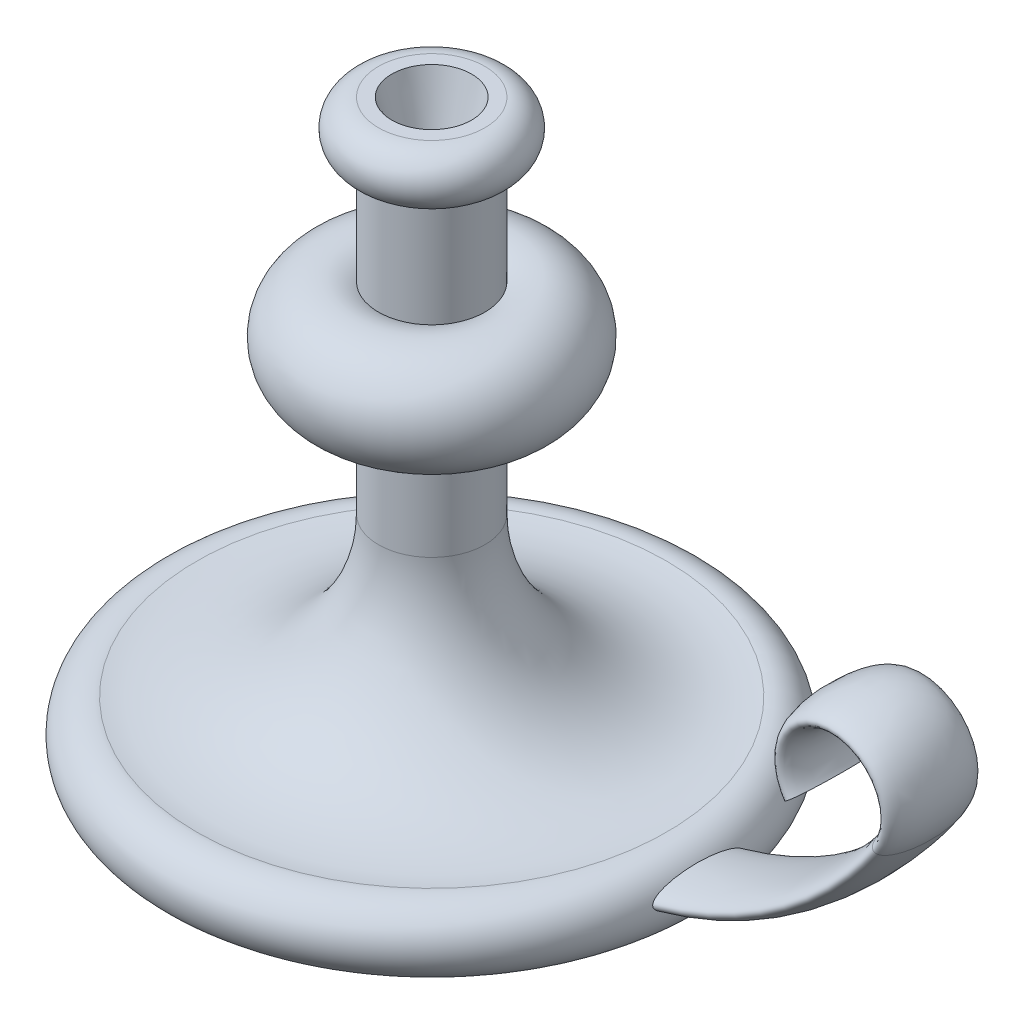
ISO-10303-21;
HEADER;
FILE_DESCRIPTION(('STEP AP214'),'2;1');
FILE_NAME('part.step','',(''),(''),'','','');
FILE_SCHEMA(('AUTOMOTIVE_DESIGN { 1 0 10303 214 1 1 1 1 }'));
ENDSEC;
DATA;
#1=APPLICATION_CONTEXT('core data for automotive mechanical design processes');
#2=APPLICATION_PROTOCOL_DEFINITION('international standard','automotive_design',2000,#1);
#3=PRODUCT_CONTEXT('',#1,'mechanical');
#4=PRODUCT('Part','Part','',(#3));
#5=PRODUCT_RELATED_PRODUCT_CATEGORY('part','',(#4));
#6=PRODUCT_DEFINITION_FORMATION('','',#4);
#7=PRODUCT_DEFINITION_CONTEXT('part definition',#1,'design');
#8=PRODUCT_DEFINITION('design','',#6,#7);
#9=PRODUCT_DEFINITION_SHAPE('','',#8);
#10=(LENGTH_UNIT() NAMED_UNIT(*) SI_UNIT(.MILLI.,.METRE.));
#11=(NAMED_UNIT(*) PLANE_ANGLE_UNIT() SI_UNIT($,.RADIAN.));
#12=(NAMED_UNIT(*) SI_UNIT($,.STERADIAN.) SOLID_ANGLE_UNIT());
#13=UNCERTAINTY_MEASURE_WITH_UNIT(LENGTH_MEASURE(1.E-05),#10,'distance_accuracy_value','');
#14=(GEOMETRIC_REPRESENTATION_CONTEXT(3) GLOBAL_UNCERTAINTY_ASSIGNED_CONTEXT((#13)) GLOBAL_UNIT_ASSIGNED_CONTEXT((#10,
#11,#12)) REPRESENTATION_CONTEXT('',''));
#15=CARTESIAN_POINT('',(0.,0.,0.));
#16=DIRECTION('',(0.,0.,1.));
#17=DIRECTION('',(1.,0.,0.));
#18=AXIS2_PLACEMENT_3D('',#15,#16,#17);
#19=CARTESIAN_POINT('',(0.,220.,0.));
#20=DIRECTION('',(0.,1.,0.));
#21=DIRECTION('',(0.,0.,1.));
#22=AXIS2_PLACEMENT_3D('',#19,#20,#21);
#23=PLANE('',#22);
#24=CARTESIAN_POINT('',(0.,220.,0.));
#25=DIRECTION('',(0.,1.,0.));
#26=DIRECTION('',(0.,0.,1.));
#27=AXIS2_PLACEMENT_3D('',#24,#25,#26);
#28=CIRCLE('',#27,15.);
#29=CARTESIAN_POINT('',(0.,220.,15.));
#30=VERTEX_POINT('',#29);
#31=EDGE_CURVE('E133',#30,#30,#28,.T.);
#32=ORIENTED_EDGE('',*,*,#31,.F.);
#33=EDGE_LOOP('',(#32));
#34=FACE_BOUND('',#33,.T.);
#35=CARTESIAN_POINT('',(0.,220.,0.));
#36=DIRECTION('',(0.,-1.,0.));
#37=DIRECTION('',(0.,0.,-1.));
#38=AXIS2_PLACEMENT_3D('',#35,#36,#37);
#39=CIRCLE('',#38,20.);
#40=CARTESIAN_POINT('',(0.,220.,-20.));
#41=VERTEX_POINT('',#40);
#42=EDGE_CURVE('E41',#41,#41,#39,.T.);
#43=ORIENTED_EDGE('',*,*,#42,.F.);
#44=EDGE_LOOP('',(#43));
#45=FACE_BOUND('',#44,.T.);
#46=ADVANCED_FACE('F31',(#34,#45),#23,.T.);
#47=CARTESIAN_POINT('',(0.,210.,0.));
#48=DIRECTION('',(0.,-1.,0.));
#49=DIRECTION('',(0.,0.,-1.));
#50=AXIS2_PLACEMENT_3D('',#47,#48,#49);
#51=TOROIDAL_SURFACE('',#50,20.,10.);
#52=ORIENTED_EDGE('',*,*,#42,.T.);
#53=EDGE_LOOP('',(#52));
#54=FACE_BOUND('',#53,.T.);
#55=CARTESIAN_POINT('',(0.,200.,0.));
#56=DIRECTION('',(0.,-1.,0.));
#57=DIRECTION('',(0.,0.,-1.));
#58=AXIS2_PLACEMENT_3D('',#55,#56,#57);
#59=CIRCLE('',#58,20.);
#60=CARTESIAN_POINT('',(0.,200.,-20.));
#61=VERTEX_POINT('',#60);
#62=EDGE_CURVE('E45',#61,#61,#59,.T.);
#63=ORIENTED_EDGE('',*,*,#62,.F.);
#64=EDGE_LOOP('',(#63));
#65=FACE_BOUND('',#64,.T.);
#66=ADVANCED_FACE('F106',(#54,#65),#51,.T.);
#67=CARTESIAN_POINT('',(0.,0.,0.));
#68=DIRECTION('',(0.,-1.,0.));
#69=DIRECTION('',(0.,0.,-1.));
#70=AXIS2_PLACEMENT_3D('',#67,#68,#69);
#71=CYLINDRICAL_SURFACE('',#70,20.);
#72=ORIENTED_EDGE('',*,*,#62,.T.);
#73=EDGE_LOOP('',(#72));
#74=FACE_BOUND('',#73,.T.);
#75=CARTESIAN_POINT('',(0.,160.,0.));
#76=DIRECTION('',(0.,-1.,0.));
#77=DIRECTION('',(0.,0.,-1.));
#78=AXIS2_PLACEMENT_3D('',#75,#76,#77);
#79=CIRCLE('',#78,20.);
#80=CARTESIAN_POINT('',(0.,160.,-20.));
#81=VERTEX_POINT('',#80);
#82=EDGE_CURVE('E49',#81,#81,#79,.T.);
#83=ORIENTED_EDGE('',*,*,#82,.F.);
#84=EDGE_LOOP('',(#83));
#85=FACE_BOUND('',#84,.T.);
#86=ADVANCED_FACE('F103',(#74,#85),#71,.T.);
#87=CARTESIAN_POINT('',(0.,142.153516540863,0.));
#88=DIRECTION('',(0.,-1.,0.));
#89=DIRECTION('',(0.,0.,-1.));
#90=AXIS2_PLACEMENT_3D('',#87,#88,#89);
#91=TOROIDAL_SURFACE('',#90,29.0279027543909,20.);
#92=ORIENTED_EDGE('',*,*,#82,.T.);
#93=EDGE_LOOP('',(#92));
#94=FACE_BOUND('',#93,.T.);
#95=CARTESIAN_POINT('',(0.,124.307033081725,0.));
#96=DIRECTION('',(0.,-1.,0.));
#97=DIRECTION('',(0.,0.,-1.));
#98=AXIS2_PLACEMENT_3D('',#95,#96,#97);
#99=CIRCLE('',#98,20.);
#100=CARTESIAN_POINT('',(0.,124.307033081725,-20.));
#101=VERTEX_POINT('',#100);
#102=EDGE_CURVE('E54',#101,#101,#99,.T.);
#103=ORIENTED_EDGE('',*,*,#102,.F.);
#104=EDGE_LOOP('',(#103));
#105=FACE_BOUND('',#104,.T.);
#106=ADVANCED_FACE('F99',(#94,#105),#91,.T.);
#107=CARTESIAN_POINT('',(0.,0.,0.));
#108=DIRECTION('',(0.,-1.,0.));
#109=DIRECTION('',(0.,0.,-1.));
#110=AXIS2_PLACEMENT_3D('',#107,#108,#109);
#111=CYLINDRICAL_SURFACE('',#110,20.);
#112=ORIENTED_EDGE('',*,*,#102,.T.);
#113=EDGE_LOOP('',(#112));
#114=FACE_BOUND('',#113,.T.);
#115=CARTESIAN_POINT('',(0.,84.3070330817253,0.));
#116=DIRECTION('',(0.,-1.,0.));
#117=DIRECTION('',(0.,0.,-1.));
#118=AXIS2_PLACEMENT_3D('',#115,#116,#117);
#119=CIRCLE('',#118,20.);
#120=CARTESIAN_POINT('',(0.,84.3070330817253,-20.));
#121=VERTEX_POINT('',#120);
#122=EDGE_CURVE('E57',#121,#121,#119,.T.);
#123=ORIENTED_EDGE('',*,*,#122,.F.);
#124=EDGE_LOOP('',(#123));
#125=FACE_BOUND('',#124,.T.);
#126=ADVANCED_FACE('F95',(#114,#125),#111,.T.);
#127=CARTESIAN_POINT('',(0.,84.3070330817254,0.));
#128=DIRECTION('',(0.,-1.,0.));
#129=DIRECTION('',(0.,0.,-1.));
#130=AXIS2_PLACEMENT_3D('',#127,#128,#129);
#131=TOROIDAL_SURFACE('',#130,80.,60.);
#132=ORIENTED_EDGE('',*,*,#122,.T.);
#133=EDGE_LOOP('',(#132));
#134=FACE_BOUND('',#133,.T.);
#135=CARTESIAN_POINT('',(0.,24.8805229451251,0.));
#136=DIRECTION('',(0.,-1.,0.));
#137=DIRECTION('',(0.,0.,-1.));
#138=AXIS2_PLACEMENT_3D('',#135,#136,#137);
#139=CIRCLE('',#138,88.2758620689655);
#140=CARTESIAN_POINT('',(0.,24.8805229451251,-88.2758620689655));
#141=VERTEX_POINT('',#140);
#142=EDGE_CURVE('E60',#141,#141,#139,.T.);
#143=ORIENTED_EDGE('',*,*,#142,.F.);
#144=EDGE_LOOP('',(#143));
#145=FACE_BOUND('',#144,.T.);
#146=ADVANCED_FACE('F91',(#134,#145),#131,.F.);
#147=CARTESIAN_POINT('',(0.,12.5,0.));
#148=DIRECTION('',(0.,-1.,0.));
#149=DIRECTION('',(0.,0.,-1.));
#150=AXIS2_PLACEMENT_3D('',#147,#148,#149);
#151=TOROIDAL_SURFACE('',#150,90.,12.5);
#152=CARTESIAN_POINT('',(100.599030768654,15.5987579670939,-17.5));
#153=CARTESIAN_POINT('',(100.587823938515,15.6419060687265,-17.4999987679289));
#154=CARTESIAN_POINT('',(100.576719797673,15.6850967512129,-17.4979055579991));
#155=CARTESIAN_POINT('',(100.554810057842,15.7711675585967,-17.4896074814758));
#156=CARTESIAN_POINT('',(100.544004655214,15.814047466174,-17.4833999744835));
#157=CARTESIAN_POINT('',(100.512105850676,15.9418725511906,-17.4588295632829));
#158=CARTESIAN_POINT('',(100.491567074093,16.0258594391262,-17.4345196863056));
#159=CARTESIAN_POINT('',(100.447012871131,16.2113098200857,-17.3642358527436));
#160=CARTESIAN_POINT('',(100.423570600568,16.3113159626448,-17.3141686162446));
#161=CARTESIAN_POINT('',(100.379605467192,16.5025492286418,-17.198526624523));
#162=CARTESIAN_POINT('',(100.359088106083,16.5937597060182,-17.1329232469089));
#163=CARTESIAN_POINT('',(100.323029116049,16.7567723986482,-16.9998685818304));
#164=CARTESIAN_POINT('',(100.307186274164,16.829572077072,-16.9336912405709));
#165=CARTESIAN_POINT('',(100.27713185631,16.969478848873,-16.7951762929768));
#166=CARTESIAN_POINT('',(100.262921635943,17.0365811997372,-16.7228336530245));
#167=CARTESIAN_POINT('',(100.235849504103,17.1658793146784,-16.5733970507498));
#168=CARTESIAN_POINT('',(100.222990788288,17.2280633671505,-16.4962924825391));
#169=CARTESIAN_POINT('',(100.198439182332,17.3479803783436,-16.3385834120146));
#170=CARTESIAN_POINT('',(100.186745914252,17.4057147786346,-16.2579800565572));
#171=CARTESIAN_POINT('',(100.164473158279,17.5166406756435,-16.0949967073935));
#172=CARTESIAN_POINT('',(100.15388202914,17.5698782207548,-16.0126494610949));
#173=CARTESIAN_POINT('',(100.133515524394,17.6730194229543,-15.845787471121));
#174=CARTESIAN_POINT('',(100.123740286728,17.7229225160111,-15.7612723640754));
#175=CARTESIAN_POINT('',(100.095434468527,17.8683492469343,-15.5048429212655));
#176=CARTESIAN_POINT('',(100.077955861093,17.9594293137125,-15.3302871276749));
#177=CARTESIAN_POINT('',(100.045116746992,18.1320960594343,-14.9762466780363));
#178=CARTESIAN_POINT('',(100.029758024612,18.2136747322354,-14.7967580205641));
#179=CARTESIAN_POINT('',(100.000640618779,18.3693132071146,-14.4332904569937));
#180=CARTESIAN_POINT('',(99.9868910044662,18.4433301185024,-14.2492925648202));
#181=CARTESIAN_POINT('',(99.9607756472923,18.5844846752871,-13.8788354785984));
#182=CARTESIAN_POINT('',(99.9484083732768,18.6516299250025,-13.6923792687573));
#183=CARTESIAN_POINT('',(99.9248094791488,18.7800310577784,-13.3174623938924));
#184=CARTESIAN_POINT('',(99.9135774669846,18.8412889736115,-13.1290024458604));
#185=CARTESIAN_POINT('',(99.8890260227945,18.9752639728929,-12.696874940086));
#186=CARTESIAN_POINT('',(99.876015257354,19.0463187539317,-12.4526753390367));
#187=CARTESIAN_POINT('',(99.8512998545946,19.1811121142247,-11.9621870001761));
#188=CARTESIAN_POINT('',(99.8395953580683,19.2448499048583,-11.7158980402413));
#189=CARTESIAN_POINT('',(99.8172932659683,19.3659458081399,-11.2213838932023));
#190=CARTESIAN_POINT('',(99.8066970801198,19.4232958016467,-10.9731566615749));
#191=CARTESIAN_POINT('',(99.7864943787407,19.532198962568,-10.4753893499855));
#192=CARTESIAN_POINT('',(99.7768879125274,19.5837518411261,-10.2258492052521));
#193=CARTESIAN_POINT('',(99.7493759513239,19.7306748221254,-9.47498418138017));
#194=CARTESIAN_POINT('',(99.7328061833505,19.8181555942166,-8.97205593261874));
#195=CARTESIAN_POINT('',(99.7027288424482,19.9752594676523,-7.96325073410434));
#196=CARTESIAN_POINT('',(99.6892220545692,20.0448779914537,-7.45737306240681));
#197=CARTESIAN_POINT('',(99.6650328353424,20.1682817417228,-6.44383421691315));
#198=CARTESIAN_POINT('',(99.6543493128774,20.2220730858888,-5.93617380918521));
#199=CARTESIAN_POINT('',(99.6356850047243,20.3152320242398,-4.92004532327358));
#200=CARTESIAN_POINT('',(99.6277013280586,20.3546150504822,-4.41157869849966));
#201=CARTESIAN_POINT('',(99.6143694293958,20.4199671292463,-3.39403545186169));
#202=CARTESIAN_POINT('',(99.6090197641447,20.4459435280385,-2.88495931760281));
#203=CARTESIAN_POINT('',(99.6009288240029,20.48509637622,-1.86637846385713));
#204=CARTESIAN_POINT('',(99.5981871525007,20.4982747718769,-1.35687382133515));
#205=CARTESIAN_POINT('',(99.594982092105,20.5136828345806,-0.223656327515213));
#206=CARTESIAN_POINT('',(99.5951657261413,20.5128029692727,0.400102803724038));
#207=CARTESIAN_POINT('',(99.5994286511468,20.4923034907719,1.64750800317501));
#208=CARTESIAN_POINT('',(99.6035092389783,20.4726776391255,2.27115396461906));
#209=CARTESIAN_POINT('',(99.6155865826206,20.4140144301101,3.51780721989538));
#210=CARTESIAN_POINT('',(99.6235852612661,20.374967541565,4.14081404947921));
#211=CARTESIAN_POINT('',(99.6435903910272,20.2759544956863,5.38716553600232));
#212=CARTESIAN_POINT('',(99.6556097004337,20.215921194064,6.01050478749116));
#213=CARTESIAN_POINT('',(99.6767753332331,20.1084577209958,6.94329733902379));
#214=CARTESIAN_POINT('',(99.684351738967,20.0697425204045,7.25380522616885));
#215=CARTESIAN_POINT('',(99.7005972051749,19.9860781176925,7.87394798339942));
#216=CARTESIAN_POINT('',(99.7092662300381,19.9411291187394,8.18358288160135));
#217=CARTESIAN_POINT('',(99.7277557970751,19.844517610058,8.80150672425716));
#218=CARTESIAN_POINT('',(99.7375753710694,19.7928607410508,9.10979657713669));
#219=CARTESIAN_POINT('',(99.7584707400079,19.6821414058327,9.72499102403031));
#220=CARTESIAN_POINT('',(99.7695464575935,19.6230793956376,10.0318957021402));
#221=CARTESIAN_POINT('',(99.7902246801304,19.5121267131684,10.5691586055677));
#222=CARTESIAN_POINT('',(99.7995257836647,19.4620105973922,10.799895058492));
#223=CARTESIAN_POINT('',(99.8190225729554,19.3565690071587,11.2601787978522));
#224=CARTESIAN_POINT('',(99.8292183933219,19.3012427487448,11.4897258998299));
#225=CARTESIAN_POINT('',(99.8506315213368,19.1847583237865,11.9474547965806));
#226=CARTESIAN_POINT('',(99.8618494951349,19.1235963527953,12.1756355961993));
#227=CARTESIAN_POINT('',(99.8854839616427,18.9946252210987,12.6304078869409));
#228=CARTESIAN_POINT('',(99.8979021291664,18.9268067694742,12.8569966696967));
#229=CARTESIAN_POINT('',(99.9240265257617,18.7843074089966,13.3055131961849));
#230=CARTESIAN_POINT('',(99.9377190390234,18.7096997315066,13.5274648412065));
#231=CARTESIAN_POINT('',(99.9668048854449,18.5518198125477,13.9680954261597));
#232=CARTESIAN_POINT('',(99.9821977179646,18.4685501219302,14.186775308007));
#233=CARTESIAN_POINT('',(100.01511325938,18.2917408460045,14.6193887443668));
#234=CARTESIAN_POINT('',(100.032632066061,18.1982201060918,14.8333301673608));
#235=CARTESIAN_POINT('',(100.061025475268,18.0483598789644,15.1493201670701));
#236=CARTESIAN_POINT('',(100.070835087872,17.9968482397019,15.25376043661));
#237=CARTESIAN_POINT('',(100.091284052933,17.8901928707775,15.4606806056678));
#238=CARTESIAN_POINT('',(100.101923276071,17.8350497074038,15.5631608076314));
#239=CARTESIAN_POINT('',(100.120972022942,17.7371217083911,15.7364813065285));
#240=CARTESIAN_POINT('',(100.129140010219,17.6953575920572,15.8079251330403));
#241=CARTESIAN_POINT('',(100.146040207252,17.609506856329,15.9493499204523));
#242=CARTESIAN_POINT('',(100.154772467724,17.5654200282371,16.0193307491089));
#243=CARTESIAN_POINT('',(100.172898354436,17.4745802148897,16.1576681875999));
#244=CARTESIAN_POINT('',(100.182293310385,17.4278219071521,16.226021141262));
#245=CARTESIAN_POINT('',(100.201824033669,17.3314262200776,16.3605622394271));
#246=CARTESIAN_POINT('',(100.211959771808,17.2817889542197,16.4267504690956));
#247=CARTESIAN_POINT('',(100.233180842355,17.1788360498509,16.5570302644311));
#248=CARTESIAN_POINT('',(100.244273799721,17.1254916912758,16.6210980273022));
#249=CARTESIAN_POINT('',(100.267473871923,17.0151105564701,16.7458297845393));
#250=CARTESIAN_POINT('',(100.279581246149,16.9580728366888,16.8064929016655));
#251=CARTESIAN_POINT('',(100.304940284446,16.8400312638608,16.9233118833063));
#252=CARTESIAN_POINT('',(100.318189128232,16.7790372730578,16.9794782307085));
#253=CARTESIAN_POINT('',(100.346023284818,16.6526045988658,17.086147514669));
#254=CARTESIAN_POINT('',(100.360607533097,16.5871694663256,17.1366548920796));
#255=CARTESIAN_POINT('',(100.393074240118,16.4436606583984,17.2358156382648));
#256=CARTESIAN_POINT('',(100.411143054691,16.3650011328248,17.2835757828362));
#257=CARTESIAN_POINT('',(100.449332436142,16.2018444963026,17.3669659228559));
#258=CARTESIAN_POINT('',(100.469451110076,16.1173527939271,17.4026069800753));
#259=CARTESIAN_POINT('',(100.501195096129,15.9867339337446,17.4446427036745));
#260=CARTESIAN_POINT('',(100.512112238886,15.9422507615907,17.4567904147897));
#261=CARTESIAN_POINT('',(100.534385714681,15.852440552756,17.4767616309462));
#262=CARTESIAN_POINT('',(100.545741818014,15.8071139637012,17.4845873657289));
#263=CARTESIAN_POINT('',(100.568809612334,15.7160225438293,17.4956420726838));
#264=CARTESIAN_POINT('',(100.580521066725,15.6702580179144,17.4988740376967));
#265=CARTESIAN_POINT('',(100.604204222534,15.5787075789195,17.5006318040391));
#266=CARTESIAN_POINT('',(100.616175899027,15.5329216682953,17.4991580541326));
#267=CARTESIAN_POINT('',(100.638799000241,15.4473282843037,17.4920217297406));
#268=CARTESIAN_POINT('',(100.649433886757,15.4074710464658,17.4868904820152));
#269=CARTESIAN_POINT('',(100.670742024886,15.3283575534604,17.4731845796895));
#270=CARTESIAN_POINT('',(100.681415287891,15.2891014987811,17.4646088012624));
#271=CARTESIAN_POINT('',(100.71338967243,15.172583680279,17.4340164040666));
#272=CARTESIAN_POINT('',(100.734648573997,15.096560227456,17.4071336213618));
#273=CARTESIAN_POINT('',(100.785762049318,14.9169278441352,17.3285682514689));
#274=CARTESIAN_POINT('',(100.815315389984,14.8157734281247,17.2711822231817));
#275=CARTESIAN_POINT('',(100.872790404397,14.6233653679573,17.1407751083836));
#276=CARTESIAN_POINT('',(100.900704921713,14.5321538444556,17.0676911272171));
#277=CARTESIAN_POINT('',(100.952359524903,14.3666962208211,16.917876237653));
#278=CARTESIAN_POINT('',(100.976250075643,14.2916627321617,16.8420477249245));
#279=CARTESIAN_POINT('',(101.022635091067,14.1483712221775,16.6841476730115));
#280=CARTESIAN_POINT('',(101.045131716485,14.0801026108417,16.6020862585973));
#281=CARTESIAN_POINT('',(101.088975075354,13.9490459950394,16.433008980197));
#282=CARTESIAN_POINT('',(101.110317858646,13.8862764111325,16.3459779650247));
#283=CARTESIAN_POINT('',(101.151912833686,13.7656314663398,16.1683164911294));
#284=CARTESIAN_POINT('',(101.172164638908,13.7077578359702,16.0776847762058));
#285=CARTESIAN_POINT('',(101.212251132823,13.5946600130286,15.89101481197));
#286=CARTESIAN_POINT('',(101.232057236809,13.5395592731081,15.7948960564911));
#287=CARTESIAN_POINT('',(101.270736122188,13.4332573494151,15.6003340837681));
#288=CARTESIAN_POINT('',(101.289608734637,13.382056870614,15.5018904504955));
#289=CARTESIAN_POINT('',(101.345009566699,13.2334363954463,15.2035204959536));
#290=CARTESIAN_POINT('',(101.380269098029,13.1411418835568,15.000800618003));
#291=CARTESIAN_POINT('',(101.447961377462,12.9672927001142,14.5902423982859));
#292=CARTESIAN_POINT('',(101.480391857487,12.8857466194049,14.382400117959));
#293=CARTESIAN_POINT('',(101.542933010892,12.7311155794086,13.9620682772087));
#294=CARTESIAN_POINT('',(101.573031302683,12.6580748654167,13.7495607038731));
#295=CARTESIAN_POINT('',(101.630974563718,12.5195609102916,13.3220711376746));
#296=CARTESIAN_POINT('',(101.658821958373,12.4540794902927,13.1070921011914));
#297=CARTESIAN_POINT('',(101.712497824724,12.3295493193546,12.675118590947));
#298=CARTESIAN_POINT('',(101.738326956694,12.2704984621491,12.4581248025236));
#299=CARTESIAN_POINT('',(101.795016890601,12.1424436502627,11.9623022606143));
#300=CARTESIAN_POINT('',(101.825296147692,12.0751975882094,11.6829539002558));
#301=CARTESIAN_POINT('',(101.883091708657,11.9485311970048,11.1221909996046));
#302=CARTESIAN_POINT('',(101.910607733224,11.889111658773,10.8407762535198));
#303=CARTESIAN_POINT('',(101.96308955675,11.7770878953262,10.2760045554257));
#304=CARTESIAN_POINT('',(101.988052217841,11.7244920350414,9.99264565968095));
#305=CARTESIAN_POINT('',(102.035529917235,11.6254726330777,9.42464255659442));
#306=CARTESIAN_POINT('',(102.058044839338,11.5790493844053,9.13999828890017));
#307=CARTESIAN_POINT('',(102.122141455271,11.448043142227,8.2838050860892));
#308=CARTESIAN_POINT('',(102.160210780906,11.3718589102676,7.71069444993996));
#309=CARTESIAN_POINT('',(102.227618344759,11.2385904251157,6.56163422998519));
#310=CARTESIAN_POINT('',(102.256954039278,11.1815117358739,5.98568386865527));
#311=CARTESIAN_POINT('',(102.307322378443,11.084336184399,4.83074252844958));
#312=CARTESIAN_POINT('',(102.32833690162,11.044276371431,4.25174766573632));
#313=CARTESIAN_POINT('',(102.362199539544,10.9800506439927,3.09324447804062));
#314=CARTESIAN_POINT('',(102.375055969399,10.9558685453426,2.51373728068555));
#315=CARTESIAN_POINT('',(102.392767462677,10.9226174212364,1.35450922228275));
#316=CARTESIAN_POINT('',(102.397627184063,10.9135395977317,0.774788682494754));
#317=CARTESIAN_POINT('',(102.399408630706,10.9102082006388,-0.384574756115364));
#318=CARTESIAN_POINT('',(102.396332143495,10.915951288826,-0.964217643018411));
#319=CARTESIAN_POINT('',(102.381921896339,10.9429657003784,-2.14707862156896));
#320=CARTESIAN_POINT('',(102.370251314113,10.9648705085297,-2.7502784963671));
#321=CARTESIAN_POINT('',(102.3381344719,11.0256418764555,-3.95578500562465));
#322=CARTESIAN_POINT('',(102.31768543547,11.0645138026414,-4.55809129693373));
#323=CARTESIAN_POINT('',(102.267743074865,11.1605843328185,-5.7613061662983));
#324=CARTESIAN_POINT('',(102.238243783184,11.2177950300421,-6.36221355775135));
#325=CARTESIAN_POINT('',(102.186999658448,11.31883137741,-7.25964819354327));
#326=CARTESIAN_POINT('',(102.168816383087,11.3549179795543,-7.55726470087478));
#327=CARTESIAN_POINT('',(102.130035724798,11.4325718000498,-8.1516210100947));
#328=CARTESIAN_POINT('',(102.109438417247,11.474138847285,-8.44836083905999));
#329=CARTESIAN_POINT('',(102.065747035594,11.5632175551803,-9.04062505282081));
#330=CARTESIAN_POINT('',(102.042654116657,11.6107264670667,-9.3361499347897));
#331=CARTESIAN_POINT('',(101.993845508524,11.7123234310105,-9.92584030785388));
#332=CARTESIAN_POINT('',(101.968129954471,11.7664111440926,-10.2200058681788));
#333=CARTESIAN_POINT('',(101.91394516264,11.8819175839043,-10.806365518003));
#334=CARTESIAN_POINT('',(101.88547845132,11.9433295964527,-11.0985611575883));
#335=CARTESIAN_POINT('',(101.825571453276,12.0745661640207,-11.6807349224116));
#336=CARTESIAN_POINT('',(101.794131528237,12.1443896960858,-11.9707133127447));
#337=CARTESIAN_POINT('',(101.742065287214,12.262087793552,-12.4250098543382));
#338=CARTESIAN_POINT('',(101.722528098501,12.3066645149578,-12.5903101226526));
#339=CARTESIAN_POINT('',(101.682309164118,12.3994293156175,-12.9197630606779));
#340=CARTESIAN_POINT('',(101.661627392555,12.4476174765789,-13.0839157043321));
#341=CARTESIAN_POINT('',(101.6189943142,12.5481310846928,-13.4111534693809));
#342=CARTESIAN_POINT('',(101.597040546976,12.6004646272561,-13.5742357931775));
#343=CARTESIAN_POINT('',(101.551797863804,12.7097198737813,-13.8986684472661));
#344=CARTESIAN_POINT('',(101.528509001696,12.7666413927622,-14.0600188470901));
#345=CARTESIAN_POINT('',(101.478992787891,12.8894004194658,-14.3903711545856));
#346=CARTESIAN_POINT('',(101.452672823818,12.9555704757528,-14.5592364702513));
#347=CARTESIAN_POINT('',(101.398182474893,13.0948877311574,-14.8937532407418));
#348=CARTESIAN_POINT('',(101.37001236928,13.1680338781318,-15.0594051756922));
#349=CARTESIAN_POINT('',(101.311628137484,13.3225234115816,-15.3859543982953));
#350=CARTESIAN_POINT('',(101.28141969355,13.4038442964803,-15.54686324205));
#351=CARTESIAN_POINT('',(101.218557307108,13.5767150252097,-15.8625209561046));
#352=CARTESIAN_POINT('',(101.185905199556,13.6682572187387,-16.0172743174624));
#353=CARTESIAN_POINT('',(101.124354343374,13.8450965226333,-16.2882733859817));
#354=CARTESIAN_POINT('',(101.095977247589,13.9280913276722,-16.4061143606372));
#355=CARTESIAN_POINT('',(101.051724085849,14.0604089025354,-16.5766077257722));
#356=CARTESIAN_POINT('',(101.036671174178,14.1058830109932,-16.6324624594111));
#357=CARTESIAN_POINT('',(101.005971778272,14.199701902029,-16.7415246433812));
#358=CARTESIAN_POINT('',(100.990325430768,14.248046024776,-16.7947326970673));
#359=CARTESIAN_POINT('',(100.95817649141,14.3486122453401,-16.8986018150987));
#360=CARTESIAN_POINT('',(100.941665137122,14.4008782101232,-16.9492182925989));
#361=CARTESIAN_POINT('',(100.907970754264,14.5089682841239,-17.0462303701746));
#362=CARTESIAN_POINT('',(100.890787537893,14.5647933909947,-17.0926247778486));
#363=CARTESIAN_POINT('',(100.83831907002,14.7377184527917,-17.223560259077));
#364=CARTESIAN_POINT('',(100.801946097966,14.860790997606,-17.3004222861392));
#365=CARTESIAN_POINT('',(100.742657662374,15.0681051844632,-17.3961821549104));
#366=CARTESIAN_POINT('',(100.720366612712,15.1474739882083,-17.4259160531982));
#367=CARTESIAN_POINT('',(100.686816424299,15.2693166544049,-17.4599047397275));
#368=CARTESIAN_POINT('',(100.675625082303,15.3103543332555,-17.4694614351913));
#369=CARTESIAN_POINT('',(100.653274675961,15.3931257501692,-17.4848109567317));
#370=CARTESIAN_POINT('',(100.642115596007,15.4348590450242,-17.4906060920148));
#371=CARTESIAN_POINT('',(100.625652810969,15.4970411665418,-17.4962859265614));
#372=CARTESIAN_POINT('',(100.620301871,15.5173496228496,-17.4976773829617));
#373=CARTESIAN_POINT('',(100.6096365753,15.5580215388814,-17.4995347812568));
#374=CARTESIAN_POINT('',(100.604322225283,15.5783850065337,-17.500000581739));
#375=CARTESIAN_POINT('',(100.599030768654,15.5987579670939,-17.5));
#376=B_SPLINE_CURVE_WITH_KNOTS('',3,(#152,#153,#154,#155,#156,#157,#158,#159,#160,#161,#162,
#163,#164,#165,#166,#167,#168,#169,#170,#171,#172,#173,#174,#175,#176,#177,#178,#179,#180,#181,
#182,#183,#184,#185,#186,#187,#188,#189,#190,#191,#192,#193,#194,#195,#196,#197,#198,#199,#200,
#201,#202,#203,#204,#205,#206,#207,#208,#209,#210,#211,#212,#213,#214,#215,#216,#217,#218,#219,
#220,#221,#222,#223,#224,#225,#226,#227,#228,#229,#230,#231,#232,#233,#234,#235,#236,#237,#238,
#239,#240,#241,#242,#243,#244,#245,#246,#247,#248,#249,#250,#251,#252,#253,#254,#255,#256,#257,
#258,#259,#260,#261,#262,#263,#264,#265,#266,#267,#268,#269,#270,#271,#272,#273,#274,#275,#276,
#277,#278,#279,#280,#281,#282,#283,#284,#285,#286,#287,#288,#289,#290,#291,#292,#293,#294,#295,
#296,#297,#298,#299,#300,#301,#302,#303,#304,#305,#306,#307,#308,#309,#310,#311,#312,#313,#314,
#315,#316,#317,#318,#319,#320,#321,#322,#323,#324,#325,#326,#327,#328,#329,#330,#331,#332,#333,
#334,#335,#336,#337,#338,#339,#340,#341,#342,#343,#344,#345,#346,#347,#348,#349,#350,#351,#352,
#353,#354,#355,#356,#357,#358,#359,#360,#361,#362,#363,#364,#365,#366,#367,#368,#369,#370,#371,
#372,#373,#374,#375),.UNSPECIFIED.,.T.,.F.,(4,2,2,2,2,2,2,2,2,2,2,2,2,2,2,2,2,2,2,2,2,2,2,2,2,2,
2,2,2,2,2,2,2,2,2,2,2,2,2,2,2,2,2,2,2,2,2,2,2,2,2,2,2,2,2,2,2,2,2,2,2,2,2,2,2,2,2,2,2,2,2,2,2,2,
2,2,2,2,2,2,2,2,2,2,2,2,2,2,2,2,2,2,2,2,2,2,2,2,2,2,2,2,2,2,2,2,2,2,2,2,2,4),(0.,
0.13371406731988,0.267514030425325,0.535552432161715,0.876471630520301,1.21802386206201,
1.51654812567466,1.81531849621989,2.11478013304839,2.4141443407781,2.70993064341083,
3.00576685308068,3.59831601249844,4.19136091250909,4.78760189697757,5.38317576761578,
5.97854325471551,6.74237823574145,7.5062954652848,8.27117284267094,9.03608831518758,
10.5678974700081,12.1000987890426,13.6317070841206,15.1616701110766,16.6907938898642,
18.2196850893785,20.0906648148267,21.9622673983035,23.8347894075376,25.7133580702887,
26.6523172778138,27.5912458906257,28.5293900001198,29.467476366137,30.1763213481873,
30.8852731592593,31.5946903533992,32.3051122062829,33.0086182611341,33.7119177258764,
34.4139452773145,34.7644824795872,35.1149651490519,35.3643983107428,35.6138539225594,
35.8638251486398,36.113786528378,36.3659649051874,36.6182079626773,36.8698447452835,
37.1212826530741,37.4018601488736,37.6821808540394,37.8241658492873,37.9660775247708,
38.1078967023655,38.2497023556725,38.3742590154202,38.4988563465927,38.7480139801455,
39.105997342189,39.4654426663308,39.7929206503094,40.1198776081337,40.447890965984,
40.7760197826844,41.1135518154061,41.4511447129336,42.1271969181651,42.8037862333142,
43.4837512764052,44.1629735880511,44.8419727538322,45.7085761323223,46.5752670194724,
47.4430105136789,48.3107951839526,50.0485063440727,51.7867231241769,53.5287047647868,
55.2689080327915,57.0080972991659,58.746894869153,60.5577317116118,62.3691417064963,
64.1817486749091,65.0827413466815,65.9837058934284,66.8842551748577,67.7847580747684,
68.6844417390155,69.5840160998102,70.1009281530574,70.6178519048095,71.1358112852224,
71.6537497926346,72.2034090726628,72.7529855830515,73.301088741489,73.8487843790253,
74.2889534081449,74.5096105273911,74.7302171114286,74.953829821076,75.1775054889376,
75.6225079479253,75.8843092495128,76.0149548537953,76.1455201792274,76.2086454441544,
76.27178035199),.UNSPECIFIED.);
#377=CARTESIAN_POINT('',(100.599030768654,15.5987579670939,-17.5));
#378=VERTEX_POINT('',#377);
#379=EDGE_CURVE('E10',#378,#378,#376,.T.);
#380=ORIENTED_EDGE('',*,*,#379,.F.);
#381=EDGE_LOOP('',(#380));
#382=FACE_BOUND('',#381,.T.);
#383=ORIENTED_EDGE('',*,*,#142,.T.);
#384=EDGE_LOOP('',(#383));
#385=FACE_BOUND('',#384,.T.);
#386=CARTESIAN_POINT('',(0.,0.,0.));
#387=DIRECTION('',(0.,-1.,0.));
#388=DIRECTION('',(0.,0.,-1.));
#389=AXIS2_PLACEMENT_3D('',#386,#387,#388);
#390=CIRCLE('',#389,90.);
#391=CARTESIAN_POINT('',(0.,0.,-90.));
#392=VERTEX_POINT('',#391);
#393=EDGE_CURVE('E63',#392,#392,#390,.T.);
#394=ORIENTED_EDGE('',*,*,#393,.F.);
#395=EDGE_LOOP('',(#394));
#396=FACE_BOUND('',#395,.T.);
#397=ADVANCED_FACE('F86',(#382,#385,#396),#151,.T.);
#398=CARTESIAN_POINT('',(0.,0.,0.));
#399=DIRECTION('',(0.,-1.,0.));
#400=DIRECTION('',(0.,0.,-1.));
#401=AXIS2_PLACEMENT_3D('',#398,#399,#400);
#402=PLANE('',#401);
#403=ORIENTED_EDGE('',*,*,#393,.T.);
#404=EDGE_LOOP('',(#403));
#405=FACE_BOUND('',#404,.T.);
#406=ADVANCED_FACE('F81',(#405),#402,.T.);
#407=CARTESIAN_POINT('',(183.592070943083,75.,0.));
#408=DIRECTION('',(0.566666666666667,0.823947139620551,0.));
#409=DIRECTION('',(0.,0.,-1.));
#410=AXIS2_PLACEMENT_3D('',#407,#408,#409);
#411=ELLIPSE('',#410,17.5,5.);
#412=CARTESIAN_POINT('',(167.113128150672,86.3333333333333,0.));
#413=DIRECTION('',(0.,0.,1.));
#414=AXIS1_PLACEMENT('',#412,#413);
#415=SURFACE_OF_REVOLUTION('',#411,#414);
#416=CARTESIAN_POINT('',(183.592070943083,75.,-17.5));
#417=VERTEX_POINT('',#416);
#418=EDGE_CURVE('E69',#417,#417,#411,.T.);
#419=ORIENTED_EDGE('',*,*,#418,.T.);
#420=EDGE_LOOP('',(#419));
#421=FACE_BOUND('',#420,.T.);
#422=CARTESIAN_POINT('',(150.634185358261,74.9999999999998,0.));
#423=DIRECTION('',(0.566666666666681,-0.823947139620542,0.));
#424=DIRECTION('',(0.,0.,-1.));
#425=AXIS2_PLACEMENT_3D('',#422,#423,#424);
#426=ELLIPSE('',#425,17.5,5.);
#427=CARTESIAN_POINT('',(150.634185358261,74.9999999999998,-17.5));
#428=VERTEX_POINT('',#427);
#429=EDGE_CURVE('E66',#428,#428,#426,.T.);
#430=ORIENTED_EDGE('',*,*,#429,.F.);
#431=EDGE_LOOP('',(#430));
#432=FACE_BOUND('',#431,.T.);
#433=ADVANCED_FACE('F77',(#421,#432),#415,.F.);
#434=CARTESIAN_POINT('',(60.,10.,0.));
#435=DIRECTION('',(1.,0.,0.));
#436=DIRECTION('',(0.,0.,-1.));
#437=AXIS2_PLACEMENT_3D('',#434,#435,#436);
#438=ELLIPSE('',#437,17.5,5.);
#439=CARTESIAN_POINT('',(60.,160.,0.));
#440=DIRECTION('',(0.,0.,1.));
#441=AXIS1_PLACEMENT('',#439,#440);
#442=SURFACE_OF_REVOLUTION('',#438,#441);
#443=ORIENTED_EDGE('',*,*,#379,.T.);
#444=EDGE_LOOP('',(#443));
#445=FACE_BOUND('',#444,.T.);
#446=ORIENTED_EDGE('',*,*,#418,.F.);
#447=EDGE_LOOP('',(#446));
#448=FACE_BOUND('',#447,.T.);
#449=ADVANCED_FACE('F80',(#445,#448),#442,.F.);
#450=CARTESIAN_POINT('',(150.634185358261,74.9999999999998,0.));
#451=DIRECTION('',(0.566666666666681,-0.823947139620542,0.));
#452=DIRECTION('',(0.,0.,-1.));
#453=AXIS2_PLACEMENT_3D('',#450,#451,#452);
#454=PLANE('',#453);
#455=ORIENTED_EDGE('',*,*,#429,.T.);
#456=EDGE_LOOP('',(#455));
#457=FACE_BOUND('',#456,.T.);
#458=ADVANCED_FACE('F143',(#457),#454,.T.);
#459=CARTESIAN_POINT('',(0.,220.,0.));
#460=DIRECTION('',(0.,1.,0.));
#461=DIRECTION('',(0.,0.,1.));
#462=AXIS2_PLACEMENT_3D('',#459,#460,#461);
#463=CONICAL_SURFACE('',#462,15.,0.26179938779915);
#464=CARTESIAN_POINT('',(0.,195.,0.));
#465=DIRECTION('',(0.,1.,0.));
#466=DIRECTION('',(0.,0.,1.));
#467=AXIS2_PLACEMENT_3D('',#464,#465,#466);
#468=CIRCLE('',#467,8.30127018922192);
#469=CARTESIAN_POINT('',(0.,195.,8.30127018922192));
#470=VERTEX_POINT('',#469);
#471=EDGE_CURVE('E73',#470,#470,#468,.T.);
#472=ORIENTED_EDGE('',*,*,#471,.F.);
#473=EDGE_LOOP('',(#472));
#474=FACE_BOUND('',#473,.T.);
#475=ORIENTED_EDGE('',*,*,#31,.T.);
#476=EDGE_LOOP('',(#475));
#477=FACE_BOUND('',#476,.T.);
#478=ADVANCED_FACE('F141',(#474,#477),#463,.F.);
#479=CARTESIAN_POINT('',(0.,195.,0.));
#480=DIRECTION('',(0.,1.,0.));
#481=DIRECTION('',(0.,0.,1.));
#482=AXIS2_PLACEMENT_3D('',#479,#480,#481);
#483=PLANE('',#482);
#484=ORIENTED_EDGE('',*,*,#471,.T.);
#485=EDGE_LOOP('',(#484));
#486=FACE_BOUND('',#485,.T.);
#487=ADVANCED_FACE('F139',(#486),#483,.T.);
#488=CLOSED_SHELL('',(#46,#66,#86,#106,#126,#146,#397,#406,#433,#449,#458,#478,#487));
#489=MANIFOLD_SOLID_BREP('B2',#488);
#490=ADVANCED_BREP_SHAPE_REPRESENTATION('',(#18,#489),#14);
#491=SHAPE_DEFINITION_REPRESENTATION(#9,#490);
ENDSEC;
END-ISO-10303-21;
